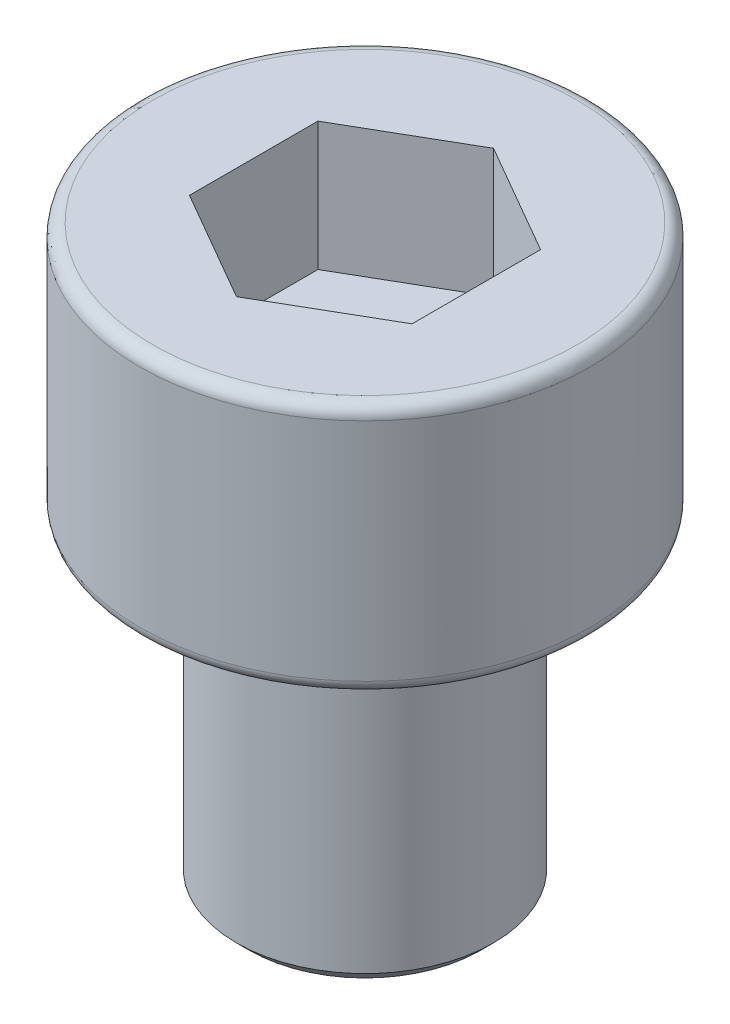
ISO-10303-21;
HEADER;
FILE_DESCRIPTION(('STEP AP214'),'2;1');
FILE_NAME('part.step','',(''),(''),'','','');
FILE_SCHEMA(('AUTOMOTIVE_DESIGN { 1 0 10303 214 1 1 1 1 }'));
ENDSEC;
DATA;
#1=APPLICATION_CONTEXT('core data for automotive mechanical design processes');
#2=APPLICATION_PROTOCOL_DEFINITION('international standard','automotive_design',2000,#1);
#3=PRODUCT_CONTEXT('',#1,'mechanical');
#4=PRODUCT('Part','Part','',(#3));
#5=PRODUCT_RELATED_PRODUCT_CATEGORY('part','',(#4));
#6=PRODUCT_DEFINITION_FORMATION('','',#4);
#7=PRODUCT_DEFINITION_CONTEXT('part definition',#1,'design');
#8=PRODUCT_DEFINITION('design','',#6,#7);
#9=PRODUCT_DEFINITION_SHAPE('','',#8);
#10=(LENGTH_UNIT() NAMED_UNIT(*) SI_UNIT(.MILLI.,.METRE.));
#11=(NAMED_UNIT(*) PLANE_ANGLE_UNIT() SI_UNIT($,.RADIAN.));
#12=(NAMED_UNIT(*) SI_UNIT($,.STERADIAN.) SOLID_ANGLE_UNIT());
#13=UNCERTAINTY_MEASURE_WITH_UNIT(LENGTH_MEASURE(1.E-05),#10,'distance_accuracy_value','');
#14=(GEOMETRIC_REPRESENTATION_CONTEXT(3) GLOBAL_UNCERTAINTY_ASSIGNED_CONTEXT((#13)) GLOBAL_UNIT_ASSIGNED_CONTEXT((#10,
#11,#12)) REPRESENTATION_CONTEXT('',''));
#15=CARTESIAN_POINT('',(0.,0.,0.));
#16=DIRECTION('',(0.,0.,1.));
#17=DIRECTION('',(1.,0.,0.));
#18=AXIS2_PLACEMENT_3D('',#15,#16,#17);
#19=CARTESIAN_POINT('',(0.,0.,0.));
#20=DIRECTION('',(0.,-1.,0.));
#21=DIRECTION('',(0.,0.,-1.));
#22=AXIS2_PLACEMENT_3D('',#19,#20,#21);
#23=PLANE('',#22);
#24=CARTESIAN_POINT('',(0.,0.,0.));
#25=DIRECTION('',(0.,-1.,0.));
#26=DIRECTION('',(0.,0.,-1.));
#27=AXIS2_PLACEMENT_3D('',#24,#25,#26);
#28=CIRCLE('',#27,3.3);
#29=CARTESIAN_POINT('',(0.,0.,-3.3));
#30=VERTEX_POINT('',#29);
#31=EDGE_CURVE('E157',#30,#30,#28,.F.);
#32=ORIENTED_EDGE('',*,*,#31,.T.);
#33=EDGE_LOOP('',(#32));
#34=FACE_BOUND('',#33,.T.);
#35=DIRECTION('',(-0.866025403784439,0.,0.5));
#36=VECTOR('',#35,1.);
#37=CARTESIAN_POINT('',(0.,0.,-2.));
#38=LINE('',#37,#36);
#39=CARTESIAN_POINT('',(0.,0.,-2.));
#40=VERTEX_POINT('',#39);
#41=CARTESIAN_POINT('',(-1.73205080756888,0.,-1.));
#42=VERTEX_POINT('',#41);
#43=EDGE_CURVE('E136',#40,#42,#38,.T.);
#44=ORIENTED_EDGE('',*,*,#43,.F.);
#45=DIRECTION('',(-0.866025403784439,0.,-0.5));
#46=VECTOR('',#45,1.);
#47=CARTESIAN_POINT('',(1.73205080756888,0.,-1.));
#48=LINE('',#47,#46);
#49=CARTESIAN_POINT('',(1.73205080756888,0.,-1.));
#50=VERTEX_POINT('',#49);
#51=EDGE_CURVE('E62',#50,#40,#48,.T.);
#52=ORIENTED_EDGE('',*,*,#51,.F.);
#53=DIRECTION('',(0.,0.,-1.));
#54=VECTOR('',#53,1.);
#55=CARTESIAN_POINT('',(1.73205080756888,0.,1.));
#56=LINE('',#55,#54);
#57=CARTESIAN_POINT('',(1.73205080756888,0.,1.));
#58=VERTEX_POINT('',#57);
#59=EDGE_CURVE('E145',#58,#50,#56,.T.);
#60=ORIENTED_EDGE('',*,*,#59,.F.);
#61=DIRECTION('',(0.866025403784439,0.,-0.5));
#62=VECTOR('',#61,1.);
#63=CARTESIAN_POINT('',(0.,0.,2.));
#64=LINE('',#63,#62);
#65=CARTESIAN_POINT('',(0.,0.,2.));
#66=VERTEX_POINT('',#65);
#67=EDGE_CURVE('E143',#66,#58,#64,.T.);
#68=ORIENTED_EDGE('',*,*,#67,.F.);
#69=DIRECTION('',(0.866025403784439,0.,0.5));
#70=VECTOR('',#69,1.);
#71=CARTESIAN_POINT('',(-1.73205080756888,0.,0.999999999999999));
#72=LINE('',#71,#70);
#73=CARTESIAN_POINT('',(-1.73205080756888,0.,0.999999999999999));
#74=VERTEX_POINT('',#73);
#75=EDGE_CURVE('E110',#74,#66,#72,.T.);
#76=ORIENTED_EDGE('',*,*,#75,.F.);
#77=DIRECTION('',(0.,0.,1.));
#78=VECTOR('',#77,1.);
#79=CARTESIAN_POINT('',(-1.73205080756888,0.,-1.));
#80=LINE('',#79,#78);
#81=EDGE_CURVE('E139',#42,#74,#80,.T.);
#82=ORIENTED_EDGE('',*,*,#81,.F.);
#83=EDGE_LOOP('',(#44,#52,#60,#68,#76,#82));
#84=FACE_BOUND('',#83,.T.);
#85=ADVANCED_FACE('F47',(#34,#84),#23,.F.);
#86=CARTESIAN_POINT('',(0.,0.,0.));
#87=DIRECTION('',(0.,1.,0.));
#88=DIRECTION('',(0.,0.,1.));
#89=AXIS2_PLACEMENT_3D('',#86,#87,#88);
#90=CYLINDRICAL_SURFACE('',#89,3.5);
#91=CARTESIAN_POINT('',(0.,-0.2,0.));
#92=DIRECTION('',(0.,-1.,0.));
#93=DIRECTION('',(0.,0.,-1.));
#94=AXIS2_PLACEMENT_3D('',#91,#92,#93);
#95=CIRCLE('',#94,3.5);
#96=CARTESIAN_POINT('',(0.,-0.2,-3.5));
#97=VERTEX_POINT('',#96);
#98=EDGE_CURVE('E163',#97,#97,#95,.T.);
#99=ORIENTED_EDGE('',*,*,#98,.T.);
#100=EDGE_LOOP('',(#99));
#101=FACE_BOUND('',#100,.T.);
#102=CARTESIAN_POINT('',(0.,-3.71,0.));
#103=DIRECTION('',(0.,1.,0.));
#104=DIRECTION('',(0.,0.,1.));
#105=AXIS2_PLACEMENT_3D('',#102,#103,#104);
#106=CIRCLE('',#105,3.5);
#107=CARTESIAN_POINT('',(0.,-3.71,3.5));
#108=VERTEX_POINT('',#107);
#109=EDGE_CURVE('E160',#108,#108,#106,.T.);
#110=ORIENTED_EDGE('',*,*,#109,.T.);
#111=EDGE_LOOP('',(#110));
#112=FACE_BOUND('',#111,.T.);
#113=ADVANCED_FACE('F185',(#101,#112),#90,.T.);
#114=CARTESIAN_POINT('',(3.5,-3.91,0.));
#115=DIRECTION('',(0.,1.,0.));
#116=DIRECTION('',(0.,0.,1.));
#117=AXIS2_PLACEMENT_3D('',#114,#115,#116);
#118=PLANE('',#117);
#119=CARTESIAN_POINT('',(0.,-3.91,0.));
#120=DIRECTION('',(0.,1.,0.));
#121=DIRECTION('',(0.,0.,1.));
#122=AXIS2_PLACEMENT_3D('',#119,#120,#121);
#123=CIRCLE('',#122,3.3);
#124=CARTESIAN_POINT('',(0.,-3.91,3.3));
#125=VERTEX_POINT('',#124);
#126=EDGE_CURVE('E166',#125,#125,#123,.F.);
#127=ORIENTED_EDGE('',*,*,#126,.T.);
#128=EDGE_LOOP('',(#127));
#129=FACE_BOUND('',#128,.T.);
#130=CARTESIAN_POINT('',(0.,-3.91,0.));
#131=DIRECTION('',(0.,1.,0.));
#132=DIRECTION('',(0.,0.,1.));
#133=AXIS2_PLACEMENT_3D('',#130,#131,#132);
#134=CIRCLE('',#133,2.);
#135=CARTESIAN_POINT('',(0.,-3.91,2.));
#136=VERTEX_POINT('',#135);
#137=EDGE_CURVE('E149',#136,#136,#134,.T.);
#138=ORIENTED_EDGE('',*,*,#137,.T.);
#139=EDGE_LOOP('',(#138));
#140=FACE_BOUND('',#139,.T.);
#141=ADVANCED_FACE('F192',(#129,#140),#118,.F.);
#142=CARTESIAN_POINT('',(0.,0.,0.));
#143=DIRECTION('',(0.,1.,0.));
#144=DIRECTION('',(0.,0.,1.));
#145=AXIS2_PLACEMENT_3D('',#142,#143,#144);
#146=CYLINDRICAL_SURFACE('',#145,2.);
#147=CARTESIAN_POINT('',(0.,-8.71,0.));
#148=DIRECTION('',(0.,1.,0.));
#149=DIRECTION('',(0.,0.,1.));
#150=AXIS2_PLACEMENT_3D('',#147,#148,#149);
#151=CIRCLE('',#150,2.);
#152=CARTESIAN_POINT('',(0.,-8.71,2.));
#153=VERTEX_POINT('',#152);
#154=EDGE_CURVE('E55',#153,#153,#151,.T.);
#155=ORIENTED_EDGE('',*,*,#154,.T.);
#156=EDGE_LOOP('',(#155));
#157=FACE_BOUND('',#156,.T.);
#158=ORIENTED_EDGE('',*,*,#137,.F.);
#159=EDGE_LOOP('',(#158));
#160=FACE_BOUND('',#159,.T.);
#161=ADVANCED_FACE('F171',(#157,#160),#146,.T.);
#162=CARTESIAN_POINT('',(2.,-8.91,0.));
#163=DIRECTION('',(0.,1.,0.));
#164=DIRECTION('',(0.,0.,1.));
#165=AXIS2_PLACEMENT_3D('',#162,#163,#164);
#166=PLANE('',#165);
#167=CARTESIAN_POINT('',(0.,-8.91,0.));
#168=DIRECTION('',(0.,1.,0.));
#169=DIRECTION('',(0.,0.,1.));
#170=AXIS2_PLACEMENT_3D('',#167,#168,#169);
#171=CIRCLE('',#170,1.8);
#172=CARTESIAN_POINT('',(0.,-8.91,1.8));
#173=VERTEX_POINT('',#172);
#174=EDGE_CURVE('E11',#173,#173,#171,.F.);
#175=ORIENTED_EDGE('',*,*,#174,.T.);
#176=EDGE_LOOP('',(#175));
#177=FACE_BOUND('',#176,.T.);
#178=ADVANCED_FACE('F231',(#177),#166,.F.);
#179=CARTESIAN_POINT('',(1.73205080756888,-2.,-1.));
#180=DIRECTION('',(0.5,0.,-0.866025403784439));
#181=DIRECTION('',(-0.866025403784439,0.,-0.5));
#182=AXIS2_PLACEMENT_3D('',#179,#180,#181);
#183=PLANE('',#182);
#184=ORIENTED_EDGE('',*,*,#51,.T.);
#185=DIRECTION('',(0.,1.,0.));
#186=VECTOR('',#185,1.);
#187=CARTESIAN_POINT('',(0.,-2.,-2.));
#188=LINE('',#187,#186);
#189=CARTESIAN_POINT('',(0.,-2.,-2.));
#190=VERTEX_POINT('',#189);
#191=EDGE_CURVE('E92',#190,#40,#188,.T.);
#192=ORIENTED_EDGE('',*,*,#191,.F.);
#193=DIRECTION('',(-0.866025403784439,0.,-0.5));
#194=VECTOR('',#193,1.);
#195=CARTESIAN_POINT('',(1.73205080756888,-2.,-1.));
#196=LINE('',#195,#194);
#197=CARTESIAN_POINT('',(1.73205080756888,-2.,-1.));
#198=VERTEX_POINT('',#197);
#199=EDGE_CURVE('E147',#198,#190,#196,.T.);
#200=ORIENTED_EDGE('',*,*,#199,.F.);
#201=DIRECTION('',(0.,1.,0.));
#202=VECTOR('',#201,1.);
#203=CARTESIAN_POINT('',(1.73205080756888,-2.,-1.));
#204=LINE('',#203,#202);
#205=EDGE_CURVE('E70',#198,#50,#204,.T.);
#206=ORIENTED_EDGE('',*,*,#205,.T.);
#207=EDGE_LOOP('',(#184,#192,#200,#206));
#208=FACE_BOUND('',#207,.T.);
#209=ADVANCED_FACE('F221',(#208),#183,.F.);
#210=CARTESIAN_POINT('',(1.73205080756888,-2.,1.));
#211=DIRECTION('',(1.,0.,0.));
#212=DIRECTION('',(0.,0.,-1.));
#213=AXIS2_PLACEMENT_3D('',#210,#211,#212);
#214=PLANE('',#213);
#215=ORIENTED_EDGE('',*,*,#59,.T.);
#216=ORIENTED_EDGE('',*,*,#205,.F.);
#217=DIRECTION('',(0.,0.,-1.));
#218=VECTOR('',#217,1.);
#219=CARTESIAN_POINT('',(1.73205080756888,-2.,1.));
#220=LINE('',#219,#218);
#221=CARTESIAN_POINT('',(1.73205080756888,-2.,1.));
#222=VERTEX_POINT('',#221);
#223=EDGE_CURVE('E122',#222,#198,#220,.T.);
#224=ORIENTED_EDGE('',*,*,#223,.F.);
#225=DIRECTION('',(0.,1.,0.));
#226=VECTOR('',#225,1.);
#227=CARTESIAN_POINT('',(1.73205080756888,-2.,1.));
#228=LINE('',#227,#226);
#229=EDGE_CURVE('E114',#222,#58,#228,.T.);
#230=ORIENTED_EDGE('',*,*,#229,.T.);
#231=EDGE_LOOP('',(#215,#216,#224,#230));
#232=FACE_BOUND('',#231,.T.);
#233=ADVANCED_FACE('F218',(#232),#214,.F.);
#234=CARTESIAN_POINT('',(0.,-2.,2.));
#235=DIRECTION('',(0.5,0.,0.866025403784439));
#236=DIRECTION('',(0.866025403784439,0.,-0.5));
#237=AXIS2_PLACEMENT_3D('',#234,#235,#236);
#238=PLANE('',#237);
#239=ORIENTED_EDGE('',*,*,#67,.T.);
#240=ORIENTED_EDGE('',*,*,#229,.F.);
#241=DIRECTION('',(0.866025403784439,0.,-0.5));
#242=VECTOR('',#241,1.);
#243=CARTESIAN_POINT('',(0.,-2.,2.));
#244=LINE('',#243,#242);
#245=CARTESIAN_POINT('',(0.,-2.,2.));
#246=VERTEX_POINT('',#245);
#247=EDGE_CURVE('E118',#246,#222,#244,.T.);
#248=ORIENTED_EDGE('',*,*,#247,.F.);
#249=DIRECTION('',(0.,1.,0.));
#250=VECTOR('',#249,1.);
#251=CARTESIAN_POINT('',(0.,-2.,2.));
#252=LINE('',#251,#250);
#253=EDGE_CURVE('E103',#246,#66,#252,.T.);
#254=ORIENTED_EDGE('',*,*,#253,.T.);
#255=EDGE_LOOP('',(#239,#240,#248,#254));
#256=FACE_BOUND('',#255,.T.);
#257=ADVANCED_FACE('F119',(#256),#238,.F.);
#258=CARTESIAN_POINT('',(-1.73205080756888,-2.,0.999999999999999));
#259=DIRECTION('',(-0.5,0.,0.866025403784439));
#260=DIRECTION('',(0.866025403784439,0.,0.5));
#261=AXIS2_PLACEMENT_3D('',#258,#259,#260);
#262=PLANE('',#261);
#263=ORIENTED_EDGE('',*,*,#75,.T.);
#264=ORIENTED_EDGE('',*,*,#253,.F.);
#265=DIRECTION('',(0.866025403784439,0.,0.5));
#266=VECTOR('',#265,1.);
#267=CARTESIAN_POINT('',(-1.73205080756888,-2.,0.999999999999999));
#268=LINE('',#267,#266);
#269=CARTESIAN_POINT('',(-1.73205080756888,-2.,0.999999999999999));
#270=VERTEX_POINT('',#269);
#271=EDGE_CURVE('E107',#270,#246,#268,.T.);
#272=ORIENTED_EDGE('',*,*,#271,.F.);
#273=DIRECTION('',(0.,1.,0.));
#274=VECTOR('',#273,1.);
#275=CARTESIAN_POINT('',(-1.73205080756888,-2.,0.999999999999999));
#276=LINE('',#275,#274);
#277=EDGE_CURVE('E115',#270,#74,#276,.T.);
#278=ORIENTED_EDGE('',*,*,#277,.T.);
#279=EDGE_LOOP('',(#263,#264,#272,#278));
#280=FACE_BOUND('',#279,.T.);
#281=ADVANCED_FACE('F105',(#280),#262,.F.);
#282=CARTESIAN_POINT('',(-1.73205080756888,-2.,-1.));
#283=DIRECTION('',(-1.,0.,0.));
#284=DIRECTION('',(0.,0.,1.));
#285=AXIS2_PLACEMENT_3D('',#282,#283,#284);
#286=PLANE('',#285);
#287=ORIENTED_EDGE('',*,*,#81,.T.);
#288=ORIENTED_EDGE('',*,*,#277,.F.);
#289=DIRECTION('',(0.,0.,1.));
#290=VECTOR('',#289,1.);
#291=CARTESIAN_POINT('',(-1.73205080756888,-2.,-1.));
#292=LINE('',#291,#290);
#293=CARTESIAN_POINT('',(-1.73205080756888,-2.,-1.));
#294=VERTEX_POINT('',#293);
#295=EDGE_CURVE('E128',#294,#270,#292,.T.);
#296=ORIENTED_EDGE('',*,*,#295,.F.);
#297=DIRECTION('',(0.,1.,0.));
#298=VECTOR('',#297,1.);
#299=CARTESIAN_POINT('',(-1.73205080756888,-2.,-1.));
#300=LINE('',#299,#298);
#301=EDGE_CURVE('E152',#294,#42,#300,.T.);
#302=ORIENTED_EDGE('',*,*,#301,.T.);
#303=EDGE_LOOP('',(#287,#288,#296,#302));
#304=FACE_BOUND('',#303,.T.);
#305=ADVANCED_FACE('F214',(#304),#286,.F.);
#306=CARTESIAN_POINT('',(0.,-2.,-2.));
#307=DIRECTION('',(-0.5,0.,-0.866025403784439));
#308=DIRECTION('',(-0.866025403784439,0.,0.5));
#309=AXIS2_PLACEMENT_3D('',#306,#307,#308);
#310=PLANE('',#309);
#311=ORIENTED_EDGE('',*,*,#43,.T.);
#312=ORIENTED_EDGE('',*,*,#301,.F.);
#313=DIRECTION('',(-0.866025403784439,0.,0.5));
#314=VECTOR('',#313,1.);
#315=CARTESIAN_POINT('',(0.,-2.,-2.));
#316=LINE('',#315,#314);
#317=EDGE_CURVE('E130',#190,#294,#316,.T.);
#318=ORIENTED_EDGE('',*,*,#317,.F.);
#319=ORIENTED_EDGE('',*,*,#191,.T.);
#320=EDGE_LOOP('',(#311,#312,#318,#319));
#321=FACE_BOUND('',#320,.T.);
#322=ADVANCED_FACE('F203',(#321),#310,.F.);
#323=CARTESIAN_POINT('',(0.,-2.,0.));
#324=DIRECTION('',(0.,1.,0.));
#325=DIRECTION('',(0.,0.,1.));
#326=AXIS2_PLACEMENT_3D('',#323,#324,#325);
#327=PLANE('',#326);
#328=ORIENTED_EDGE('',*,*,#199,.T.);
#329=ORIENTED_EDGE('',*,*,#317,.T.);
#330=ORIENTED_EDGE('',*,*,#295,.T.);
#331=ORIENTED_EDGE('',*,*,#271,.T.);
#332=ORIENTED_EDGE('',*,*,#247,.T.);
#333=ORIENTED_EDGE('',*,*,#223,.T.);
#334=EDGE_LOOP('',(#328,#329,#330,#331,#332,#333));
#335=FACE_BOUND('',#334,.T.);
#336=ADVANCED_FACE('F125',(#335),#327,.T.);
#337=CARTESIAN_POINT('',(0.,-0.2,0.));
#338=DIRECTION('',(0.,-1.,0.));
#339=DIRECTION('',(0.,0.,-1.));
#340=AXIS2_PLACEMENT_3D('',#337,#338,#339);
#341=TOROIDAL_SURFACE('',#340,3.3,0.2);
#342=ORIENTED_EDGE('',*,*,#98,.F.);
#343=EDGE_LOOP('',(#342));
#344=FACE_BOUND('',#343,.T.);
#345=ORIENTED_EDGE('',*,*,#31,.F.);
#346=EDGE_LOOP('',(#345));
#347=FACE_BOUND('',#346,.T.);
#348=ADVANCED_FACE('F181',(#344,#347),#341,.T.);
#349=CARTESIAN_POINT('',(0.,-3.71,0.));
#350=DIRECTION('',(0.,1.,0.));
#351=DIRECTION('',(0.,0.,1.));
#352=AXIS2_PLACEMENT_3D('',#349,#350,#351);
#353=TOROIDAL_SURFACE('',#352,3.3,0.2);
#354=ORIENTED_EDGE('',*,*,#126,.F.);
#355=EDGE_LOOP('',(#354));
#356=FACE_BOUND('',#355,.T.);
#357=ORIENTED_EDGE('',*,*,#109,.F.);
#358=EDGE_LOOP('',(#357));
#359=FACE_BOUND('',#358,.T.);
#360=ADVANCED_FACE('F175',(#356,#359),#353,.T.);
#361=CARTESIAN_POINT('',(0.,-8.71,0.));
#362=DIRECTION('',(0.,1.,0.));
#363=DIRECTION('',(0.,0.,1.));
#364=AXIS2_PLACEMENT_3D('',#361,#362,#363);
#365=CONICAL_SURFACE('',#364,2.,0.785398163397448);
#366=ORIENTED_EDGE('',*,*,#174,.F.);
#367=EDGE_LOOP('',(#366));
#368=FACE_BOUND('',#367,.T.);
#369=ORIENTED_EDGE('',*,*,#154,.F.);
#370=EDGE_LOOP('',(#369));
#371=FACE_BOUND('',#370,.T.);
#372=ADVANCED_FACE('F49',(#368,#371),#365,.T.);
#373=CLOSED_SHELL('',(#85,#113,#141,#161,#178,#209,#233,#257,#281,#305,#322,#336,#348,#360,#372));
#374=MANIFOLD_SOLID_BREP('B2',#373);
#375=ADVANCED_BREP_SHAPE_REPRESENTATION('',(#18,#374),#14);
#376=SHAPE_DEFINITION_REPRESENTATION(#9,#375);
ENDSEC;
END-ISO-10303-21;
